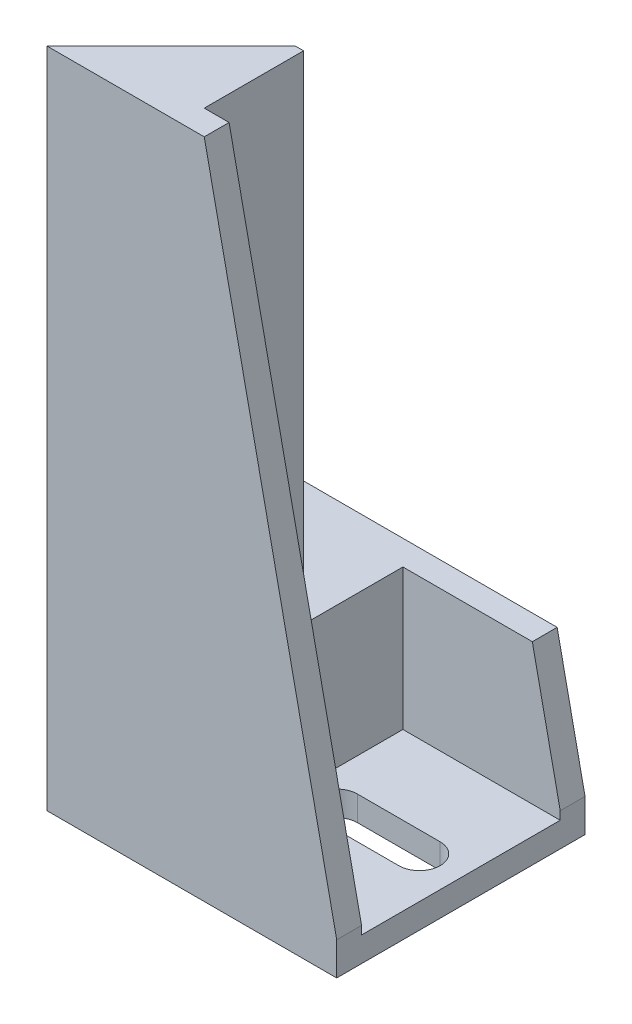
ISO-10303-21;
HEADER;
FILE_DESCRIPTION(('STEP AP214'),'2;1');
FILE_NAME('part.step','',(''),(''),'','','');
FILE_SCHEMA(('AUTOMOTIVE_DESIGN { 1 0 10303 214 1 1 1 1 }'));
ENDSEC;
DATA;
#1=APPLICATION_CONTEXT('core data for automotive mechanical design processes');
#2=APPLICATION_PROTOCOL_DEFINITION('international standard','automotive_design',2000,#1);
#3=PRODUCT_CONTEXT('',#1,'mechanical');
#4=PRODUCT('Part','Part','',(#3));
#5=PRODUCT_RELATED_PRODUCT_CATEGORY('part','',(#4));
#6=PRODUCT_DEFINITION_FORMATION('','',#4);
#7=PRODUCT_DEFINITION_CONTEXT('part definition',#1,'design');
#8=PRODUCT_DEFINITION('design','',#6,#7);
#9=PRODUCT_DEFINITION_SHAPE('','',#8);
#10=(LENGTH_UNIT() NAMED_UNIT(*) SI_UNIT(.MILLI.,.METRE.));
#11=(NAMED_UNIT(*) PLANE_ANGLE_UNIT() SI_UNIT($,.RADIAN.));
#12=(NAMED_UNIT(*) SI_UNIT($,.STERADIAN.) SOLID_ANGLE_UNIT());
#13=UNCERTAINTY_MEASURE_WITH_UNIT(LENGTH_MEASURE(1.E-05),#10,'distance_accuracy_value','');
#14=(GEOMETRIC_REPRESENTATION_CONTEXT(3) GLOBAL_UNCERTAINTY_ASSIGNED_CONTEXT((#13)) GLOBAL_UNIT_ASSIGNED_CONTEXT((#10,
#11,#12)) REPRESENTATION_CONTEXT('',''));
#15=CARTESIAN_POINT('',(0.,0.,0.));
#16=DIRECTION('',(0.,0.,1.));
#17=DIRECTION('',(1.,0.,0.));
#18=AXIS2_PLACEMENT_3D('',#15,#16,#17);
#19=CARTESIAN_POINT('',(9.525,-26.9407683632074,9.525));
#20=DIRECTION('',(0.707106781186548,0.,0.707106781186547));
#21=DIRECTION('',(0.707106781186547,0.,-0.707106781186548));
#22=AXIS2_PLACEMENT_3D('',#19,#20,#21);
#23=PLANE('',#22);
#24=DIRECTION('',(-0.707106781186547,0.,0.707106781186547));
#25=VECTOR('',#24,1.);
#26=CARTESIAN_POINT('',(0.,25.4,19.05));
#27=LINE('',#26,#25);
#28=CARTESIAN_POINT('',(0.,25.4,19.05));
#29=VERTEX_POINT('',#28);
#30=CARTESIAN_POINT('',(-19.05,25.4,38.1));
#31=VERTEX_POINT('',#30);
#32=EDGE_CURVE('E58',#29,#31,#27,.T.);
#33=ORIENTED_EDGE('',*,*,#32,.T.);
#34=DIRECTION('',(0.,1.,0.));
#35=VECTOR('',#34,1.);
#36=CARTESIAN_POINT('',(-19.05,-26.9407683632074,38.1));
#37=LINE('',#36,#35);
#38=CARTESIAN_POINT('',(-19.05,101.6,38.1));
#39=VERTEX_POINT('',#38);
#40=EDGE_CURVE('E284',#31,#39,#37,.T.);
#41=ORIENTED_EDGE('',*,*,#40,.T.);
#42=DIRECTION('',(0.707106781186547,0.,-0.707106781186548));
#43=VECTOR('',#42,1.);
#44=CARTESIAN_POINT('',(9.525,101.6,9.525));
#45=LINE('',#44,#43);
#46=CARTESIAN_POINT('',(0.,101.6,19.05));
#47=VERTEX_POINT('',#46);
#48=EDGE_CURVE('E179',#39,#47,#45,.T.);
#49=ORIENTED_EDGE('',*,*,#48,.T.);
#50=DIRECTION('',(0.,1.,0.));
#51=VECTOR('',#50,1.);
#52=CARTESIAN_POINT('',(0.,-26.9407683632074,19.05));
#53=LINE('',#52,#51);
#54=EDGE_CURVE('E178',#29,#47,#53,.T.);
#55=ORIENTED_EDGE('',*,*,#54,.F.);
#56=EDGE_LOOP('',(#33,#41,#49,#55));
#57=FACE_BOUND('',#56,.T.);
#58=ADVANCED_FACE('F35',(#57),#23,.F.);
#59=CARTESIAN_POINT('',(25.4,5.08,38.1));
#60=DIRECTION('',(-0.978549784986749,-0.206010481049842,0.));
#61=DIRECTION('',(0.206010481049842,-0.978549784986749,0.));
#62=AXIS2_PLACEMENT_3D('',#59,#60,#61);
#63=PLANE('',#62);
#64=DIRECTION('',(-0.206010481049842,0.978549784986749,0.));
#65=VECTOR('',#64,1.);
#66=CARTESIAN_POINT('',(25.4,5.08,0.));
#67=LINE('',#66,#65);
#68=CARTESIAN_POINT('',(25.4,5.08,0.));
#69=VERTEX_POINT('',#68);
#70=CARTESIAN_POINT('',(21.1221052631579,25.4,0.));
#71=VERTEX_POINT('',#70);
#72=EDGE_CURVE('E227',#69,#71,#67,.T.);
#73=ORIENTED_EDGE('',*,*,#72,.T.);
#74=DIRECTION('',(0.,0.,1.));
#75=VECTOR('',#74,1.);
#76=CARTESIAN_POINT('',(21.1221052631579,25.4,38.1));
#77=LINE('',#76,#75);
#78=CARTESIAN_POINT('',(21.1221052631579,25.4,3.81));
#79=VERTEX_POINT('',#78);
#80=EDGE_CURVE('E168',#71,#79,#77,.T.);
#81=ORIENTED_EDGE('',*,*,#80,.T.);
#82=DIRECTION('',(-0.206010481049842,0.978549784986749,0.));
#83=VECTOR('',#82,1.);
#84=CARTESIAN_POINT('',(25.4,5.08,3.81));
#85=LINE('',#84,#83);
#86=CARTESIAN_POINT('',(25.4,5.08,3.81));
#87=VERTEX_POINT('',#86);
#88=EDGE_CURVE('E217',#87,#79,#85,.T.);
#89=ORIENTED_EDGE('',*,*,#88,.F.);
#90=DIRECTION('',(0.,0.,-1.));
#91=VECTOR('',#90,1.);
#92=CARTESIAN_POINT('',(25.4,5.08,38.1));
#93=LINE('',#92,#91);
#94=EDGE_CURVE('E241',#87,#69,#93,.T.);
#95=ORIENTED_EDGE('',*,*,#94,.T.);
#96=EDGE_LOOP('',(#73,#81,#89,#95));
#97=FACE_BOUND('',#96,.T.);
#98=ADVANCED_FACE('F248',(#97),#63,.F.);
#99=CARTESIAN_POINT('',(0.,3.81,38.1));
#100=DIRECTION('',(0.,1.,0.));
#101=DIRECTION('',(0.,0.,1.));
#102=AXIS2_PLACEMENT_3D('',#99,#100,#101);
#103=PLANE('',#102);
#104=DIRECTION('',(1.,0.,0.));
#105=VECTOR('',#104,1.);
#106=CARTESIAN_POINT('',(0.,3.81,3.81));
#107=LINE('',#106,#105);
#108=CARTESIAN_POINT('',(1.27,3.81,3.81));
#109=VERTEX_POINT('',#108);
#110=CARTESIAN_POINT('',(25.4,3.81,3.81));
#111=VERTEX_POINT('',#110);
#112=EDGE_CURVE('E215',#109,#111,#107,.T.);
#113=ORIENTED_EDGE('',*,*,#112,.F.);
#114=DIRECTION('',(0.,0.,-1.));
#115=VECTOR('',#114,1.);
#116=CARTESIAN_POINT('',(1.27,3.81,3.81));
#117=LINE('',#116,#115);
#118=CARTESIAN_POINT('',(1.27000000000001,3.81,34.29));
#119=VERTEX_POINT('',#118);
#120=EDGE_CURVE('E265',#119,#109,#117,.T.);
#121=ORIENTED_EDGE('',*,*,#120,.F.);
#122=DIRECTION('',(1.,0.,0.));
#123=VECTOR('',#122,1.);
#124=CARTESIAN_POINT('',(0.,3.81,34.29));
#125=LINE('',#124,#123);
#126=CARTESIAN_POINT('',(25.4,3.81,34.29));
#127=VERTEX_POINT('',#126);
#128=EDGE_CURVE('E218',#119,#127,#125,.T.);
#129=ORIENTED_EDGE('',*,*,#128,.T.);
#130=DIRECTION('',(0.,0.,1.));
#131=VECTOR('',#130,1.);
#132=CARTESIAN_POINT('',(25.4,3.81,3.81));
#133=LINE('',#132,#131);
#134=EDGE_CURVE('E262',#111,#127,#133,.T.);
#135=ORIENTED_EDGE('',*,*,#134,.F.);
#136=EDGE_LOOP('',(#113,#121,#129,#135));
#137=FACE_BOUND('',#136,.T.);
#138=CARTESIAN_POINT('',(6.35,3.81,19.05));
#139=DIRECTION('',(0.,1.,0.));
#140=DIRECTION('',(0.,0.,1.));
#141=AXIS2_PLACEMENT_3D('',#138,#139,#140);
#142=CIRCLE('',#141,3.175);
#143=CARTESIAN_POINT('',(6.35,3.81,22.225));
#144=VERTEX_POINT('',#143);
#145=CARTESIAN_POINT('',(6.35,3.81,15.875));
#146=VERTEX_POINT('',#145);
#147=EDGE_CURVE('E200',#144,#146,#142,.F.);
#148=ORIENTED_EDGE('',*,*,#147,.T.);
#149=DIRECTION('',(1.,0.,0.));
#150=VECTOR('',#149,1.);
#151=CARTESIAN_POINT('',(6.35,3.81,15.875));
#152=LINE('',#151,#150);
#153=CARTESIAN_POINT('',(19.05,3.81,15.875));
#154=VERTEX_POINT('',#153);
#155=EDGE_CURVE('E188',#146,#154,#152,.T.);
#156=ORIENTED_EDGE('',*,*,#155,.T.);
#157=CARTESIAN_POINT('',(19.05,3.81,19.05));
#158=DIRECTION('',(0.,1.,0.));
#159=DIRECTION('',(0.,0.,1.));
#160=AXIS2_PLACEMENT_3D('',#157,#158,#159);
#161=CIRCLE('',#160,3.175);
#162=CARTESIAN_POINT('',(19.05,3.81,22.225));
#163=VERTEX_POINT('',#162);
#164=EDGE_CURVE('E208',#154,#163,#161,.F.);
#165=ORIENTED_EDGE('',*,*,#164,.T.);
#166=DIRECTION('',(-1.,0.,0.));
#167=VECTOR('',#166,1.);
#168=CARTESIAN_POINT('',(6.35,3.81,22.225));
#169=LINE('',#168,#167);
#170=EDGE_CURVE('E204',#163,#144,#169,.T.);
#171=ORIENTED_EDGE('',*,*,#170,.T.);
#172=EDGE_LOOP('',(#148,#156,#165,#171));
#173=FACE_BOUND('',#172,.T.);
#174=ADVANCED_FACE('F309',(#137,#173),#103,.T.);
#175=CARTESIAN_POINT('',(25.4,5.08,38.1));
#176=VERTEX_POINT('',#175);
#177=CARTESIAN_POINT('',(25.4,5.08,34.29));
#178=VERTEX_POINT('',#177);
#179=EDGE_CURVE('E43',#176,#178,#93,.T.);
#180=ORIENTED_EDGE('',*,*,#179,.T.);
#181=DIRECTION('',(-0.206010481049842,0.978549784986749,0.));
#182=VECTOR('',#181,1.);
#183=CARTESIAN_POINT('',(25.4,5.08,34.29));
#184=LINE('',#183,#182);
#185=CARTESIAN_POINT('',(5.08,101.6,34.29));
#186=VERTEX_POINT('',#185);
#187=EDGE_CURVE('E220',#178,#186,#184,.T.);
#188=ORIENTED_EDGE('',*,*,#187,.T.);
#189=DIRECTION('',(0.,0.,-1.));
#190=VECTOR('',#189,1.);
#191=CARTESIAN_POINT('',(5.08,101.6,38.1));
#192=LINE('',#191,#190);
#193=CARTESIAN_POINT('',(5.08,101.6,38.1));
#194=VERTEX_POINT('',#193);
#195=EDGE_CURVE('E234',#194,#186,#192,.T.);
#196=ORIENTED_EDGE('',*,*,#195,.F.);
#197=DIRECTION('',(-0.206010481049842,0.978549784986749,0.));
#198=VECTOR('',#197,1.);
#199=CARTESIAN_POINT('',(25.4,5.08,38.1));
#200=LINE('',#199,#198);
#201=EDGE_CURVE('E229',#176,#194,#200,.T.);
#202=ORIENTED_EDGE('',*,*,#201,.F.);
#203=EDGE_LOOP('',(#180,#188,#196,#202));
#204=FACE_BOUND('',#203,.T.);
#205=ADVANCED_FACE('F315',(#204),#63,.F.);
#206=CARTESIAN_POINT('',(0.,0.,38.1));
#207=DIRECTION('',(0.,1.,0.));
#208=DIRECTION('',(0.,0.,1.));
#209=AXIS2_PLACEMENT_3D('',#206,#207,#208);
#210=PLANE('',#209);
#211=CARTESIAN_POINT('',(19.05,0.,19.05));
#212=DIRECTION('',(0.,-1.,0.));
#213=DIRECTION('',(0.,0.,-1.));
#214=AXIS2_PLACEMENT_3D('',#211,#212,#213);
#215=CIRCLE('',#214,3.175);
#216=CARTESIAN_POINT('',(19.05,0.,15.875));
#217=VERTEX_POINT('',#216);
#218=CARTESIAN_POINT('',(19.05,0.,22.225));
#219=VERTEX_POINT('',#218);
#220=EDGE_CURVE('E189',#217,#219,#215,.T.);
#221=ORIENTED_EDGE('',*,*,#220,.F.);
#222=DIRECTION('',(1.,0.,0.));
#223=VECTOR('',#222,1.);
#224=CARTESIAN_POINT('',(6.35,0.,15.875));
#225=LINE('',#224,#223);
#226=CARTESIAN_POINT('',(6.35,0.,15.875));
#227=VERTEX_POINT('',#226);
#228=EDGE_CURVE('E192',#227,#217,#225,.T.);
#229=ORIENTED_EDGE('',*,*,#228,.F.);
#230=CARTESIAN_POINT('',(6.35,0.,19.05));
#231=DIRECTION('',(0.,-1.,0.));
#232=DIRECTION('',(0.,0.,-1.));
#233=AXIS2_PLACEMENT_3D('',#230,#231,#232);
#234=CIRCLE('',#233,3.175);
#235=CARTESIAN_POINT('',(6.35,0.,22.225));
#236=VERTEX_POINT('',#235);
#237=EDGE_CURVE('E181',#236,#227,#234,.T.);
#238=ORIENTED_EDGE('',*,*,#237,.F.);
#239=DIRECTION('',(-1.,0.,0.));
#240=VECTOR('',#239,1.);
#241=CARTESIAN_POINT('',(6.35,0.,22.225));
#242=LINE('',#241,#240);
#243=EDGE_CURVE('E186',#219,#236,#242,.T.);
#244=ORIENTED_EDGE('',*,*,#243,.F.);
#245=EDGE_LOOP('',(#221,#229,#238,#244));
#246=FACE_BOUND('',#245,.T.);
#247=DIRECTION('',(1.,0.,0.));
#248=VECTOR('',#247,1.);
#249=CARTESIAN_POINT('',(0.,0.,0.));
#250=LINE('',#249,#248);
#251=CARTESIAN_POINT('',(-19.05,0.,0.));
#252=VERTEX_POINT('',#251);
#253=CARTESIAN_POINT('',(25.4,0.,0.));
#254=VERTEX_POINT('',#253);
#255=EDGE_CURVE('E177',#252,#254,#250,.T.);
#256=ORIENTED_EDGE('',*,*,#255,.T.);
#257=DIRECTION('',(0.,0.,-1.));
#258=VECTOR('',#257,1.);
#259=CARTESIAN_POINT('',(25.4,0.,38.1));
#260=LINE('',#259,#258);
#261=CARTESIAN_POINT('',(25.4,0.,38.1));
#262=VERTEX_POINT('',#261);
#263=EDGE_CURVE('E11',#262,#254,#260,.T.);
#264=ORIENTED_EDGE('',*,*,#263,.F.);
#265=DIRECTION('',(1.,0.,0.));
#266=VECTOR('',#265,1.);
#267=CARTESIAN_POINT('',(0.,0.,38.1));
#268=LINE('',#267,#266);
#269=CARTESIAN_POINT('',(-19.05,0.,38.1));
#270=VERTEX_POINT('',#269);
#271=EDGE_CURVE('E224',#270,#262,#268,.T.);
#272=ORIENTED_EDGE('',*,*,#271,.F.);
#273=DIRECTION('',(0.,0.,-1.));
#274=VECTOR('',#273,1.);
#275=CARTESIAN_POINT('',(-19.05,0.,38.1));
#276=LINE('',#275,#274);
#277=EDGE_CURVE('E162',#270,#252,#276,.T.);
#278=ORIENTED_EDGE('',*,*,#277,.T.);
#279=EDGE_LOOP('',(#256,#264,#272,#278));
#280=FACE_BOUND('',#279,.T.);
#281=ADVANCED_FACE('F37',(#246,#280),#210,.F.);
#282=CARTESIAN_POINT('',(25.4,0.,38.1));
#283=DIRECTION('',(-1.,0.,0.));
#284=DIRECTION('',(0.,0.,1.));
#285=AXIS2_PLACEMENT_3D('',#282,#283,#284);
#286=PLANE('',#285);
#287=ORIENTED_EDGE('',*,*,#94,.F.);
#288=DIRECTION('',(0.,1.,0.));
#289=VECTOR('',#288,1.);
#290=CARTESIAN_POINT('',(25.4,-35.0652787771354,3.81));
#291=LINE('',#290,#289);
#292=EDGE_CURVE('E266',#111,#87,#291,.T.);
#293=ORIENTED_EDGE('',*,*,#292,.F.);
#294=ORIENTED_EDGE('',*,*,#134,.T.);
#295=DIRECTION('',(0.,1.,0.));
#296=VECTOR('',#295,1.);
#297=CARTESIAN_POINT('',(25.4,-35.0652787771354,34.29));
#298=LINE('',#297,#296);
#299=EDGE_CURVE('E274',#127,#178,#298,.T.);
#300=ORIENTED_EDGE('',*,*,#299,.T.);
#301=ORIENTED_EDGE('',*,*,#179,.F.);
#302=DIRECTION('',(0.,1.,0.));
#303=VECTOR('',#302,1.);
#304=CARTESIAN_POINT('',(25.4,0.,38.1));
#305=LINE('',#304,#303);
#306=EDGE_CURVE('E226',#262,#176,#305,.T.);
#307=ORIENTED_EDGE('',*,*,#306,.F.);
#308=ORIENTED_EDGE('',*,*,#263,.T.);
#309=DIRECTION('',(0.,1.,0.));
#310=VECTOR('',#309,1.);
#311=CARTESIAN_POINT('',(25.4,0.,0.));
#312=LINE('',#311,#310);
#313=EDGE_CURVE('E236',#254,#69,#312,.T.);
#314=ORIENTED_EDGE('',*,*,#313,.T.);
#315=EDGE_LOOP('',(#287,#293,#294,#300,#301,#307,#308,#314));
#316=FACE_BOUND('',#315,.T.);
#317=ADVANCED_FACE('F252',(#316),#286,.F.);
#318=CARTESIAN_POINT('',(5.08,101.6,38.1));
#319=DIRECTION('',(0.,-1.,0.));
#320=DIRECTION('',(0.,0.,-1.));
#321=AXIS2_PLACEMENT_3D('',#318,#319,#320);
#322=PLANE('',#321);
#323=DIRECTION('',(0.,0.,1.));
#324=VECTOR('',#323,1.);
#325=CARTESIAN_POINT('',(1.27,101.6,3.81));
#326=LINE('',#325,#324);
#327=CARTESIAN_POINT('',(1.27,101.6,19.05));
#328=VERTEX_POINT('',#327);
#329=CARTESIAN_POINT('',(1.27000000000001,101.6,34.29));
#330=VERTEX_POINT('',#329);
#331=EDGE_CURVE('E267',#328,#330,#326,.T.);
#332=ORIENTED_EDGE('',*,*,#331,.F.);
#333=DIRECTION('',(1.,0.,0.));
#334=VECTOR('',#333,1.);
#335=CARTESIAN_POINT('',(-19.05,101.6,19.05));
#336=LINE('',#335,#334);
#337=EDGE_CURVE('E50',#47,#328,#336,.T.);
#338=ORIENTED_EDGE('',*,*,#337,.F.);
#339=ORIENTED_EDGE('',*,*,#48,.F.);
#340=DIRECTION('',(-1.,0.,0.));
#341=VECTOR('',#340,1.);
#342=CARTESIAN_POINT('',(5.08,101.6,38.1));
#343=LINE('',#342,#341);
#344=EDGE_CURVE('E231',#194,#39,#343,.T.);
#345=ORIENTED_EDGE('',*,*,#344,.F.);
#346=ORIENTED_EDGE('',*,*,#195,.T.);
#347=DIRECTION('',(1.,0.,0.));
#348=VECTOR('',#347,1.);
#349=CARTESIAN_POINT('',(25.4,101.6,34.29));
#350=LINE('',#349,#348);
#351=EDGE_CURVE('E269',#330,#186,#350,.T.);
#352=ORIENTED_EDGE('',*,*,#351,.F.);
#353=EDGE_LOOP('',(#332,#338,#339,#345,#346,#352));
#354=FACE_BOUND('',#353,.T.);
#355=ADVANCED_FACE('F292',(#354),#322,.F.);
#356=CARTESIAN_POINT('',(0.,0.,38.1));
#357=DIRECTION('',(0.,0.,1.));
#358=DIRECTION('',(1.,0.,0.));
#359=AXIS2_PLACEMENT_3D('',#356,#357,#358);
#360=PLANE('',#359);
#361=ORIENTED_EDGE('',*,*,#344,.T.);
#362=ORIENTED_EDGE('',*,*,#40,.F.);
#363=EDGE_CURVE('E160',#270,#31,#37,.T.);
#364=ORIENTED_EDGE('',*,*,#363,.F.);
#365=ORIENTED_EDGE('',*,*,#271,.T.);
#366=ORIENTED_EDGE('',*,*,#306,.T.);
#367=ORIENTED_EDGE('',*,*,#201,.T.);
#368=EDGE_LOOP('',(#361,#362,#364,#365,#366,#367));
#369=FACE_BOUND('',#368,.T.);
#370=ADVANCED_FACE('F288',(#369),#360,.T.);
#371=CARTESIAN_POINT('',(0.,0.,0.));
#372=DIRECTION('',(0.,0.,1.));
#373=DIRECTION('',(1.,0.,0.));
#374=AXIS2_PLACEMENT_3D('',#371,#372,#373);
#375=PLANE('',#374);
#376=DIRECTION('',(0.,1.,0.));
#377=VECTOR('',#376,1.);
#378=CARTESIAN_POINT('',(-19.05,-26.9407683632074,0.));
#379=LINE('',#378,#377);
#380=CARTESIAN_POINT('',(-19.05,25.4,0.));
#381=VERTEX_POINT('',#380);
#382=EDGE_CURVE('E158',#252,#381,#379,.T.);
#383=ORIENTED_EDGE('',*,*,#382,.T.);
#384=DIRECTION('',(-1.,0.,0.));
#385=VECTOR('',#384,1.);
#386=CARTESIAN_POINT('',(-19.05,25.4,0.));
#387=LINE('',#386,#385);
#388=EDGE_CURVE('E165',#71,#381,#387,.T.);
#389=ORIENTED_EDGE('',*,*,#388,.F.);
#390=ORIENTED_EDGE('',*,*,#72,.F.);
#391=ORIENTED_EDGE('',*,*,#313,.F.);
#392=ORIENTED_EDGE('',*,*,#255,.F.);
#393=EDGE_LOOP('',(#383,#389,#390,#391,#392));
#394=FACE_BOUND('',#393,.T.);
#395=ADVANCED_FACE('F175',(#394),#375,.F.);
#396=CARTESIAN_POINT('',(0.,0.,34.29));
#397=DIRECTION('',(0.,0.,1.));
#398=DIRECTION('',(1.,0.,0.));
#399=AXIS2_PLACEMENT_3D('',#396,#397,#398);
#400=PLANE('',#399);
#401=ORIENTED_EDGE('',*,*,#128,.F.);
#402=DIRECTION('',(0.,1.,0.));
#403=VECTOR('',#402,1.);
#404=CARTESIAN_POINT('',(1.27000000000001,-35.0652787771354,34.29));
#405=LINE('',#404,#403);
#406=EDGE_CURVE('E277',#119,#330,#405,.T.);
#407=ORIENTED_EDGE('',*,*,#406,.T.);
#408=ORIENTED_EDGE('',*,*,#351,.T.);
#409=ORIENTED_EDGE('',*,*,#187,.F.);
#410=ORIENTED_EDGE('',*,*,#299,.F.);
#411=EDGE_LOOP('',(#401,#407,#408,#409,#410));
#412=FACE_BOUND('',#411,.T.);
#413=ADVANCED_FACE('F314',(#412),#400,.F.);
#414=CARTESIAN_POINT('',(0.,0.,3.81));
#415=DIRECTION('',(0.,0.,1.));
#416=DIRECTION('',(1.,0.,0.));
#417=AXIS2_PLACEMENT_3D('',#414,#415,#416);
#418=PLANE('',#417);
#419=DIRECTION('',(1.,0.,0.));
#420=VECTOR('',#419,1.);
#421=CARTESIAN_POINT('',(0.,25.4,3.81));
#422=LINE('',#421,#420);
#423=CARTESIAN_POINT('',(1.27,25.4,3.81));
#424=VERTEX_POINT('',#423);
#425=EDGE_CURVE('E258',#424,#79,#422,.T.);
#426=ORIENTED_EDGE('',*,*,#425,.F.);
#427=DIRECTION('',(0.,1.,0.));
#428=VECTOR('',#427,1.);
#429=CARTESIAN_POINT('',(1.27,-35.0652787771354,3.81));
#430=LINE('',#429,#428);
#431=EDGE_CURVE('E272',#109,#424,#430,.T.);
#432=ORIENTED_EDGE('',*,*,#431,.F.);
#433=ORIENTED_EDGE('',*,*,#112,.T.);
#434=ORIENTED_EDGE('',*,*,#292,.T.);
#435=ORIENTED_EDGE('',*,*,#88,.T.);
#436=EDGE_LOOP('',(#426,#432,#433,#434,#435));
#437=FACE_BOUND('',#436,.T.);
#438=ADVANCED_FACE('F305',(#437),#418,.T.);
#439=CARTESIAN_POINT('',(6.35,23.8904631420692,15.875));
#440=DIRECTION('',(0.,0.,-1.));
#441=DIRECTION('',(-1.,0.,0.));
#442=AXIS2_PLACEMENT_3D('',#439,#440,#441);
#443=PLANE('',#442);
#444=DIRECTION('',(0.,-1.,0.));
#445=VECTOR('',#444,1.);
#446=CARTESIAN_POINT('',(6.35,23.8904631420692,15.875));
#447=LINE('',#446,#445);
#448=EDGE_CURVE('E202',#146,#227,#447,.T.);
#449=ORIENTED_EDGE('',*,*,#448,.T.);
#450=ORIENTED_EDGE('',*,*,#228,.T.);
#451=DIRECTION('',(0.,-1.,0.));
#452=VECTOR('',#451,1.);
#453=CARTESIAN_POINT('',(19.05,23.8904631420692,15.875));
#454=LINE('',#453,#452);
#455=EDGE_CURVE('E199',#154,#217,#454,.T.);
#456=ORIENTED_EDGE('',*,*,#455,.F.);
#457=ORIENTED_EDGE('',*,*,#155,.F.);
#458=EDGE_LOOP('',(#449,#450,#456,#457));
#459=FACE_BOUND('',#458,.T.);
#460=ADVANCED_FACE('F345',(#459),#443,.F.);
#461=CARTESIAN_POINT('',(19.05,23.8904631420692,19.05));
#462=DIRECTION('',(0.,-1.,0.));
#463=DIRECTION('',(0.,0.,-1.));
#464=AXIS2_PLACEMENT_3D('',#461,#462,#463);
#465=CYLINDRICAL_SURFACE('',#464,3.175);
#466=ORIENTED_EDGE('',*,*,#455,.T.);
#467=ORIENTED_EDGE('',*,*,#220,.T.);
#468=DIRECTION('',(0.,-1.,0.));
#469=VECTOR('',#468,1.);
#470=CARTESIAN_POINT('',(19.05,23.8904631420692,22.225));
#471=LINE('',#470,#469);
#472=EDGE_CURVE('E207',#163,#219,#471,.T.);
#473=ORIENTED_EDGE('',*,*,#472,.F.);
#474=ORIENTED_EDGE('',*,*,#164,.F.);
#475=EDGE_LOOP('',(#466,#467,#473,#474));
#476=FACE_BOUND('',#475,.T.);
#477=ADVANCED_FACE('F341',(#476),#465,.F.);
#478=CARTESIAN_POINT('',(6.35,23.8904631420692,22.225));
#479=DIRECTION('',(0.,0.,1.));
#480=DIRECTION('',(1.,0.,0.));
#481=AXIS2_PLACEMENT_3D('',#478,#479,#480);
#482=PLANE('',#481);
#483=ORIENTED_EDGE('',*,*,#472,.T.);
#484=ORIENTED_EDGE('',*,*,#243,.T.);
#485=DIRECTION('',(0.,-1.,0.));
#486=VECTOR('',#485,1.);
#487=CARTESIAN_POINT('',(6.35,23.8904631420692,22.225));
#488=LINE('',#487,#486);
#489=EDGE_CURVE('E203',#144,#236,#488,.T.);
#490=ORIENTED_EDGE('',*,*,#489,.F.);
#491=ORIENTED_EDGE('',*,*,#170,.F.);
#492=EDGE_LOOP('',(#483,#484,#490,#491));
#493=FACE_BOUND('',#492,.T.);
#494=ADVANCED_FACE('F337',(#493),#482,.F.);
#495=CARTESIAN_POINT('',(6.35,23.8904631420692,19.05));
#496=DIRECTION('',(0.,-1.,0.));
#497=DIRECTION('',(0.,0.,-1.));
#498=AXIS2_PLACEMENT_3D('',#495,#496,#497);
#499=CYLINDRICAL_SURFACE('',#498,3.175);
#500=ORIENTED_EDGE('',*,*,#489,.T.);
#501=ORIENTED_EDGE('',*,*,#237,.T.);
#502=ORIENTED_EDGE('',*,*,#448,.F.);
#503=ORIENTED_EDGE('',*,*,#147,.F.);
#504=EDGE_LOOP('',(#500,#501,#502,#503));
#505=FACE_BOUND('',#504,.T.);
#506=ADVANCED_FACE('F334',(#505),#499,.F.);
#507=CARTESIAN_POINT('',(1.27,-35.0652787771354,3.81));
#508=DIRECTION('',(-1.,0.,0.));
#509=DIRECTION('',(0.,0.,1.));
#510=AXIS2_PLACEMENT_3D('',#507,#508,#509);
#511=PLANE('',#510);
#512=ORIENTED_EDGE('',*,*,#431,.T.);
#513=DIRECTION('',(0.,0.,1.));
#514=VECTOR('',#513,1.);
#515=CARTESIAN_POINT('',(1.27,25.4,3.81));
#516=LINE('',#515,#514);
#517=CARTESIAN_POINT('',(1.27,25.4,19.05));
#518=VERTEX_POINT('',#517);
#519=EDGE_CURVE('E299',#424,#518,#516,.T.);
#520=ORIENTED_EDGE('',*,*,#519,.T.);
#521=DIRECTION('',(0.,1.,0.));
#522=VECTOR('',#521,1.);
#523=CARTESIAN_POINT('',(1.27,-35.0652787771354,19.05));
#524=LINE('',#523,#522);
#525=EDGE_CURVE('E172',#518,#328,#524,.T.);
#526=ORIENTED_EDGE('',*,*,#525,.T.);
#527=ORIENTED_EDGE('',*,*,#331,.T.);
#528=ORIENTED_EDGE('',*,*,#406,.F.);
#529=ORIENTED_EDGE('',*,*,#120,.T.);
#530=EDGE_LOOP('',(#512,#520,#526,#527,#528,#529));
#531=FACE_BOUND('',#530,.T.);
#532=ADVANCED_FACE('F332',(#531),#511,.F.);
#533=CARTESIAN_POINT('',(-19.05,25.4,38.1));
#534=DIRECTION('',(-1.,0.,0.));
#535=DIRECTION('',(0.,0.,1.));
#536=AXIS2_PLACEMENT_3D('',#533,#534,#535);
#537=PLANE('',#536);
#538=ORIENTED_EDGE('',*,*,#277,.F.);
#539=ORIENTED_EDGE('',*,*,#363,.T.);
#540=DIRECTION('',(0.,0.,-1.));
#541=VECTOR('',#540,1.);
#542=CARTESIAN_POINT('',(-19.05,25.4,38.1));
#543=LINE('',#542,#541);
#544=EDGE_CURVE('E153',#31,#381,#543,.T.);
#545=ORIENTED_EDGE('',*,*,#544,.T.);
#546=ORIENTED_EDGE('',*,*,#382,.F.);
#547=EDGE_LOOP('',(#538,#539,#545,#546));
#548=FACE_BOUND('',#547,.T.);
#549=ADVANCED_FACE('F156',(#548),#537,.T.);
#550=CARTESIAN_POINT('',(0.,25.4,0.));
#551=DIRECTION('',(0.,-1.,0.));
#552=DIRECTION('',(0.,0.,-1.));
#553=AXIS2_PLACEMENT_3D('',#550,#551,#552);
#554=PLANE('',#553);
#555=ORIENTED_EDGE('',*,*,#32,.F.);
#556=DIRECTION('',(1.,0.,0.));
#557=VECTOR('',#556,1.);
#558=CARTESIAN_POINT('',(-19.05,25.4,19.05));
#559=LINE('',#558,#557);
#560=EDGE_CURVE('E173',#29,#518,#559,.T.);
#561=ORIENTED_EDGE('',*,*,#560,.T.);
#562=ORIENTED_EDGE('',*,*,#519,.F.);
#563=ORIENTED_EDGE('',*,*,#425,.T.);
#564=ORIENTED_EDGE('',*,*,#80,.F.);
#565=ORIENTED_EDGE('',*,*,#388,.T.);
#566=ORIENTED_EDGE('',*,*,#544,.F.);
#567=EDGE_LOOP('',(#555,#561,#562,#563,#564,#565,#566));
#568=FACE_BOUND('',#567,.T.);
#569=ADVANCED_FACE('F166',(#568),#554,.F.);
#570=CARTESIAN_POINT('',(-19.05,-22.9601592222358,19.05));
#571=DIRECTION('',(0.,0.,1.));
#572=DIRECTION('',(1.,0.,0.));
#573=AXIS2_PLACEMENT_3D('',#570,#571,#572);
#574=PLANE('',#573);
#575=ORIENTED_EDGE('',*,*,#337,.T.);
#576=ORIENTED_EDGE('',*,*,#525,.F.);
#577=ORIENTED_EDGE('',*,*,#560,.F.);
#578=ORIENTED_EDGE('',*,*,#54,.T.);
#579=EDGE_LOOP('',(#575,#576,#577,#578));
#580=FACE_BOUND('',#579,.T.);
#581=ADVANCED_FACE('F436',(#580),#574,.F.);
#582=CLOSED_SHELL('',(#58,#98,#174,#205,#281,#317,#355,#370,#395,#413,#438,#460,#477,#494,#506,
#532,#549,#569,#581));
#583=MANIFOLD_SOLID_BREP('B2',#582);
#584=ADVANCED_BREP_SHAPE_REPRESENTATION('',(#18,#583),#14);
#585=SHAPE_DEFINITION_REPRESENTATION(#9,#584);
ENDSEC;
END-ISO-10303-21;
